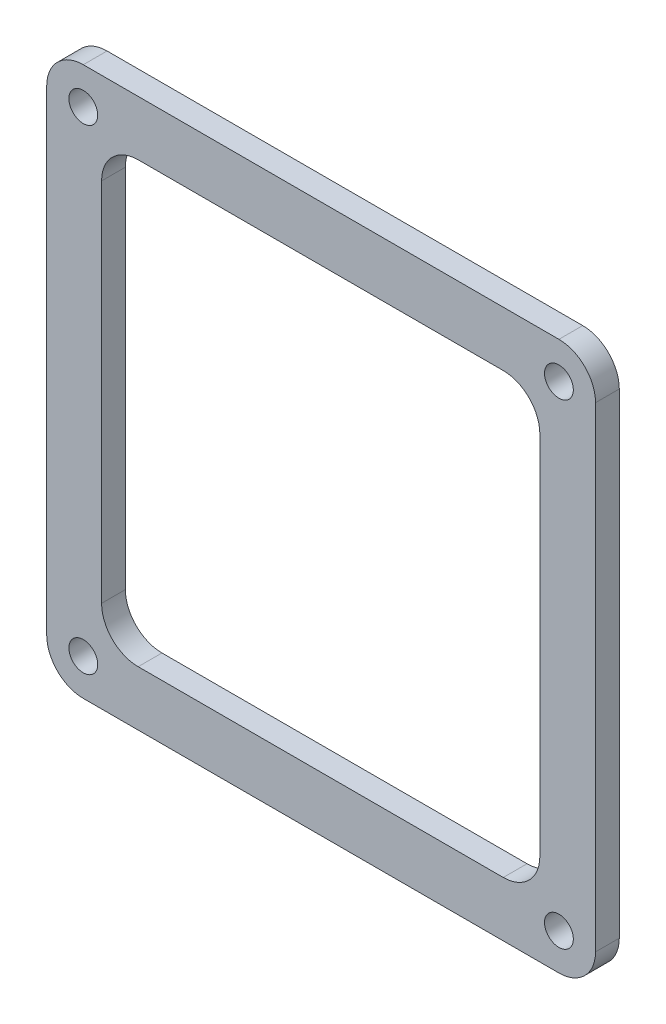
ISO-10303-21;
HEADER;
FILE_DESCRIPTION(('STEP AP214'),'2;1');
FILE_NAME('part.step','',(''),(''),'','','');
FILE_SCHEMA(('AUTOMOTIVE_DESIGN { 1 0 10303 214 1 1 1 1 }'));
ENDSEC;
DATA;
#1=APPLICATION_CONTEXT('core data for automotive mechanical design processes');
#2=APPLICATION_PROTOCOL_DEFINITION('international standard','automotive_design',2000,#1);
#3=PRODUCT_CONTEXT('',#1,'mechanical');
#4=PRODUCT('Part','Part','',(#3));
#5=PRODUCT_RELATED_PRODUCT_CATEGORY('part','',(#4));
#6=PRODUCT_DEFINITION_FORMATION('','',#4);
#7=PRODUCT_DEFINITION_CONTEXT('part definition',#1,'design');
#8=PRODUCT_DEFINITION('design','',#6,#7);
#9=PRODUCT_DEFINITION_SHAPE('','',#8);
#10=(LENGTH_UNIT() NAMED_UNIT(*) SI_UNIT(.MILLI.,.METRE.));
#11=(NAMED_UNIT(*) PLANE_ANGLE_UNIT() SI_UNIT($,.RADIAN.));
#12=(NAMED_UNIT(*) SI_UNIT($,.STERADIAN.) SOLID_ANGLE_UNIT());
#13=UNCERTAINTY_MEASURE_WITH_UNIT(LENGTH_MEASURE(1.E-05),#10,'distance_accuracy_value','');
#14=(GEOMETRIC_REPRESENTATION_CONTEXT(3) GLOBAL_UNCERTAINTY_ASSIGNED_CONTEXT((#13)) GLOBAL_UNIT_ASSIGNED_CONTEXT((#10,
#11,#12)) REPRESENTATION_CONTEXT('',''));
#15=CARTESIAN_POINT('',(0.,0.,0.));
#16=DIRECTION('',(0.,0.,1.));
#17=DIRECTION('',(1.,0.,0.));
#18=AXIS2_PLACEMENT_3D('',#15,#16,#17);
#19=CARTESIAN_POINT('',(2323.08711280439,1815.35890547452,2.6));
#20=DIRECTION('',(0.,0.,1.));
#21=DIRECTION('',(1.,0.,0.));
#22=AXIS2_PLACEMENT_3D('',#19,#20,#21);
#23=PLANE('',#22);
#24=CARTESIAN_POINT('',(2271.08711280439,1815.35890547452,2.6));
#25=DIRECTION('',(0.,0.,1.));
#26=DIRECTION('',(1.,0.,0.));
#27=AXIS2_PLACEMENT_3D('',#24,#25,#26);
#28=CIRCLE('',#27,1.57499999999988);
#29=CARTESIAN_POINT('',(2272.66211280439,1815.35890547452,2.6));
#30=VERTEX_POINT('',#29);
#31=EDGE_CURVE('E217',#30,#30,#28,.T.);
#32=ORIENTED_EDGE('',*,*,#31,.F.);
#33=EDGE_LOOP('',(#32));
#34=FACE_BOUND('',#33,.T.);
#35=CARTESIAN_POINT('',(2271.08711280439,1763.35890547452,2.6));
#36=DIRECTION('',(0.,0.,1.));
#37=DIRECTION('',(1.,0.,0.));
#38=AXIS2_PLACEMENT_3D('',#35,#36,#37);
#39=CIRCLE('',#38,1.57499999999988);
#40=CARTESIAN_POINT('',(2272.66211280439,1763.35890547452,2.6));
#41=VERTEX_POINT('',#40);
#42=EDGE_CURVE('E229',#41,#41,#39,.T.);
#43=ORIENTED_EDGE('',*,*,#42,.F.);
#44=EDGE_LOOP('',(#43));
#45=FACE_BOUND('',#44,.T.);
#46=CARTESIAN_POINT('',(2323.08711280439,1815.35890547452,2.6));
#47=DIRECTION('',(0.,0.,1.));
#48=DIRECTION('',(1.,0.,0.));
#49=AXIS2_PLACEMENT_3D('',#46,#47,#48);
#50=CIRCLE('',#49,4.);
#51=CARTESIAN_POINT('',(2327.08711280439,1815.35890547452,2.6));
#52=VERTEX_POINT('',#51);
#53=CARTESIAN_POINT('',(2323.08711280439,1819.35890547452,2.6));
#54=VERTEX_POINT('',#53);
#55=EDGE_CURVE('E235',#52,#54,#50,.T.);
#56=ORIENTED_EDGE('',*,*,#55,.T.);
#57=DIRECTION('',(-1.,0.,0.));
#58=VECTOR('',#57,1.);
#59=CARTESIAN_POINT('',(2271.08711280439,1819.35890547452,2.6));
#60=LINE('',#59,#58);
#61=CARTESIAN_POINT('',(2271.08711280439,1819.35890547452,2.6));
#62=VERTEX_POINT('',#61);
#63=EDGE_CURVE('E238',#54,#62,#60,.T.);
#64=ORIENTED_EDGE('',*,*,#63,.T.);
#65=CARTESIAN_POINT('',(2271.08711280439,1815.35890547452,2.6));
#66=DIRECTION('',(0.,0.,1.));
#67=DIRECTION('',(1.,0.,0.));
#68=AXIS2_PLACEMENT_3D('',#65,#66,#67);
#69=CIRCLE('',#68,4.);
#70=CARTESIAN_POINT('',(2267.08711280439,1815.35890547452,2.6));
#71=VERTEX_POINT('',#70);
#72=EDGE_CURVE('E241',#62,#71,#69,.T.);
#73=ORIENTED_EDGE('',*,*,#72,.T.);
#74=DIRECTION('',(0.,-1.,0.));
#75=VECTOR('',#74,1.);
#76=CARTESIAN_POINT('',(2267.08711280439,1815.35890547452,2.6));
#77=LINE('',#76,#75);
#78=CARTESIAN_POINT('',(2267.08711280439,1763.35890547452,2.6));
#79=VERTEX_POINT('',#78);
#80=EDGE_CURVE('E243',#71,#79,#77,.T.);
#81=ORIENTED_EDGE('',*,*,#80,.T.);
#82=CARTESIAN_POINT('',(2271.08711280439,1763.35890547452,2.6));
#83=DIRECTION('',(0.,0.,1.));
#84=DIRECTION('',(1.,0.,0.));
#85=AXIS2_PLACEMENT_3D('',#82,#83,#84);
#86=CIRCLE('',#85,4.);
#87=CARTESIAN_POINT('',(2271.08711280439,1759.35890547452,2.6));
#88=VERTEX_POINT('',#87);
#89=EDGE_CURVE('E245',#79,#88,#86,.T.);
#90=ORIENTED_EDGE('',*,*,#89,.T.);
#91=DIRECTION('',(1.,0.,0.));
#92=VECTOR('',#91,1.);
#93=CARTESIAN_POINT('',(2271.08711280439,1759.35890547452,2.6));
#94=LINE('',#93,#92);
#95=CARTESIAN_POINT('',(2323.08711280439,1759.35890547452,2.6));
#96=VERTEX_POINT('',#95);
#97=EDGE_CURVE('E247',#88,#96,#94,.T.);
#98=ORIENTED_EDGE('',*,*,#97,.T.);
#99=CARTESIAN_POINT('',(2323.08711280439,1763.35890547452,2.6));
#100=DIRECTION('',(0.,0.,1.));
#101=DIRECTION('',(1.,0.,0.));
#102=AXIS2_PLACEMENT_3D('',#99,#100,#101);
#103=CIRCLE('',#102,4.);
#104=CARTESIAN_POINT('',(2327.08711280439,1763.35890547452,2.6));
#105=VERTEX_POINT('',#104);
#106=EDGE_CURVE('E249',#96,#105,#103,.T.);
#107=ORIENTED_EDGE('',*,*,#106,.T.);
#108=DIRECTION('',(0.,1.,0.));
#109=VECTOR('',#108,1.);
#110=CARTESIAN_POINT('',(2327.08711280439,1763.35890547452,2.6));
#111=LINE('',#110,#109);
#112=EDGE_CURVE('E251',#105,#52,#111,.T.);
#113=ORIENTED_EDGE('',*,*,#112,.T.);
#114=EDGE_LOOP('',(#56,#64,#73,#81,#90,#98,#107,#113));
#115=FACE_BOUND('',#114,.T.);
#116=CARTESIAN_POINT('',(2323.08711280439,1763.35890547452,2.6));
#117=DIRECTION('',(0.,0.,1.));
#118=DIRECTION('',(1.,0.,0.));
#119=AXIS2_PLACEMENT_3D('',#116,#117,#118);
#120=CIRCLE('',#119,1.57499999999988);
#121=CARTESIAN_POINT('',(2324.66211280439,1763.35890547452,2.6));
#122=VERTEX_POINT('',#121);
#123=EDGE_CURVE('E223',#122,#122,#120,.T.);
#124=ORIENTED_EDGE('',*,*,#123,.F.);
#125=EDGE_LOOP('',(#124));
#126=FACE_BOUND('',#125,.T.);
#127=CARTESIAN_POINT('',(2323.08711280439,1815.35890547452,2.6));
#128=DIRECTION('',(0.,0.,1.));
#129=DIRECTION('',(1.,0.,0.));
#130=AXIS2_PLACEMENT_3D('',#127,#128,#129);
#131=CIRCLE('',#130,1.57499999999988);
#132=CARTESIAN_POINT('',(2324.66211280439,1815.35890547452,2.6));
#133=VERTEX_POINT('',#132);
#134=EDGE_CURVE('E211',#133,#133,#131,.T.);
#135=ORIENTED_EDGE('',*,*,#134,.F.);
#136=EDGE_LOOP('',(#135));
#137=FACE_BOUND('',#136,.T.);
#138=DIRECTION('',(-1.,0.,0.));
#139=VECTOR('',#138,1.);
#140=CARTESIAN_POINT('',(2295.48348301945,1813.35761142783,2.6));
#141=LINE('',#140,#139);
#142=CARTESIAN_POINT('',(2317.00050245466,1813.35761142783,2.6));
#143=VERTEX_POINT('',#142);
#144=CARTESIAN_POINT('',(2277.08711280439,1813.35761142783,2.6));
#145=VERTEX_POINT('',#144);
#146=EDGE_CURVE('E154',#143,#145,#141,.T.);
#147=ORIENTED_EDGE('',*,*,#146,.F.);
#148=CARTESIAN_POINT('',(2317.00050245466,1809.35761142783,2.6));
#149=DIRECTION('',(0.,0.,1.));
#150=DIRECTION('',(1.,0.,0.));
#151=AXIS2_PLACEMENT_3D('',#148,#149,#150);
#152=CIRCLE('',#151,4.00000000000023);
#153=CARTESIAN_POINT('',(2321.00050245466,1809.35761142783,2.6));
#154=VERTEX_POINT('',#153);
#155=EDGE_CURVE('E146',#154,#143,#152,.T.);
#156=ORIENTED_EDGE('',*,*,#155,.F.);
#157=DIRECTION('',(0.,1.,0.));
#158=VECTOR('',#157,1.);
#159=CARTESIAN_POINT('',(2321.00050245466,1809.35761142783,2.6));
#160=LINE('',#159,#158);
#161=CARTESIAN_POINT('',(2321.00050245466,1769.36244502732,2.6));
#162=VERTEX_POINT('',#161);
#163=EDGE_CURVE('E179',#162,#154,#160,.T.);
#164=ORIENTED_EDGE('',*,*,#163,.F.);
#165=CARTESIAN_POINT('',(2317.00050245466,1769.36244502732,2.6));
#166=DIRECTION('',(0.,0.,1.));
#167=DIRECTION('',(1.,0.,0.));
#168=AXIS2_PLACEMENT_3D('',#165,#166,#167);
#169=CIRCLE('',#168,4.00000000000023);
#170=CARTESIAN_POINT('',(2317.00050245466,1765.36244502732,2.6));
#171=VERTEX_POINT('',#170);
#172=EDGE_CURVE('E177',#171,#162,#169,.T.);
#173=ORIENTED_EDGE('',*,*,#172,.F.);
#174=DIRECTION('',(1.,0.,0.));
#175=VECTOR('',#174,1.);
#176=CARTESIAN_POINT('',(2317.00050245466,1765.36244502732,2.6));
#177=LINE('',#176,#175);
#178=CARTESIAN_POINT('',(2277.08711280439,1765.36244502732,2.6));
#179=VERTEX_POINT('',#178);
#180=EDGE_CURVE('E175',#179,#171,#177,.T.);
#181=ORIENTED_EDGE('',*,*,#180,.F.);
#182=CARTESIAN_POINT('',(2277.08711280439,1769.36244502732,2.6));
#183=DIRECTION('',(0.,0.,1.));
#184=DIRECTION('',(1.,0.,0.));
#185=AXIS2_PLACEMENT_3D('',#182,#183,#184);
#186=CIRCLE('',#185,4.);
#187=CARTESIAN_POINT('',(2273.08711280439,1769.36244502732,2.6));
#188=VERTEX_POINT('',#187);
#189=EDGE_CURVE('E173',#188,#179,#186,.T.);
#190=ORIENTED_EDGE('',*,*,#189,.F.);
#191=DIRECTION('',(0.,-1.,0.));
#192=VECTOR('',#191,1.);
#193=CARTESIAN_POINT('',(2273.08711280439,1769.36244502732,2.6));
#194=LINE('',#193,#192);
#195=CARTESIAN_POINT('',(2273.08711280439,1809.35761142783,2.6));
#196=VERTEX_POINT('',#195);
#197=EDGE_CURVE('E169',#196,#188,#194,.T.);
#198=ORIENTED_EDGE('',*,*,#197,.F.);
#199=CARTESIAN_POINT('',(2277.08711280439,1809.35761142783,2.6));
#200=DIRECTION('',(0.,0.,1.));
#201=DIRECTION('',(1.,0.,0.));
#202=AXIS2_PLACEMENT_3D('',#199,#200,#201);
#203=CIRCLE('',#202,4.);
#204=EDGE_CURVE('E167',#145,#196,#203,.T.);
#205=ORIENTED_EDGE('',*,*,#204,.F.);
#206=EDGE_LOOP('',(#147,#156,#164,#173,#181,#190,#198,#205));
#207=FACE_BOUND('',#206,.T.);
#208=ADVANCED_FACE('F33',(#34,#45,#115,#126,#137,#207),#23,.T.);
#209=CARTESIAN_POINT('',(2323.08711280439,1815.35890547452,0.));
#210=DIRECTION('',(0.,0.,1.));
#211=DIRECTION('',(1.,0.,0.));
#212=AXIS2_PLACEMENT_3D('',#209,#210,#211);
#213=PLANE('',#212);
#214=CARTESIAN_POINT('',(2323.08711280439,1815.35890547452,0.));
#215=DIRECTION('',(0.,0.,1.));
#216=DIRECTION('',(1.,0.,0.));
#217=AXIS2_PLACEMENT_3D('',#214,#215,#216);
#218=CIRCLE('',#217,1.57499999999988);
#219=CARTESIAN_POINT('',(2324.66211280439,1815.35890547452,0.));
#220=VERTEX_POINT('',#219);
#221=EDGE_CURVE('E162',#220,#220,#218,.T.);
#222=ORIENTED_EDGE('',*,*,#221,.T.);
#223=EDGE_LOOP('',(#222));
#224=FACE_BOUND('',#223,.T.);
#225=CARTESIAN_POINT('',(2271.08711280439,1815.35890547452,0.));
#226=DIRECTION('',(0.,0.,1.));
#227=DIRECTION('',(1.,0.,0.));
#228=AXIS2_PLACEMENT_3D('',#225,#226,#227);
#229=CIRCLE('',#228,1.57499999999988);
#230=CARTESIAN_POINT('',(2272.66211280439,1815.35890547452,0.));
#231=VERTEX_POINT('',#230);
#232=EDGE_CURVE('E214',#231,#231,#229,.T.);
#233=ORIENTED_EDGE('',*,*,#232,.T.);
#234=EDGE_LOOP('',(#233));
#235=FACE_BOUND('',#234,.T.);
#236=CARTESIAN_POINT('',(2323.08711280439,1763.35890547452,0.));
#237=DIRECTION('',(0.,0.,1.));
#238=DIRECTION('',(1.,0.,0.));
#239=AXIS2_PLACEMENT_3D('',#236,#237,#238);
#240=CIRCLE('',#239,1.57499999999988);
#241=CARTESIAN_POINT('',(2324.66211280439,1763.35890547452,0.));
#242=VERTEX_POINT('',#241);
#243=EDGE_CURVE('E220',#242,#242,#240,.T.);
#244=ORIENTED_EDGE('',*,*,#243,.T.);
#245=EDGE_LOOP('',(#244));
#246=FACE_BOUND('',#245,.T.);
#247=CARTESIAN_POINT('',(2271.08711280439,1763.35890547452,0.));
#248=DIRECTION('',(0.,0.,1.));
#249=DIRECTION('',(1.,0.,0.));
#250=AXIS2_PLACEMENT_3D('',#247,#248,#249);
#251=CIRCLE('',#250,1.57499999999988);
#252=CARTESIAN_POINT('',(2272.66211280439,1763.35890547452,0.));
#253=VERTEX_POINT('',#252);
#254=EDGE_CURVE('E226',#253,#253,#251,.T.);
#255=ORIENTED_EDGE('',*,*,#254,.T.);
#256=EDGE_LOOP('',(#255));
#257=FACE_BOUND('',#256,.T.);
#258=CARTESIAN_POINT('',(2323.08711280439,1815.35890547452,0.));
#259=DIRECTION('',(0.,0.,1.));
#260=DIRECTION('',(1.,0.,0.));
#261=AXIS2_PLACEMENT_3D('',#258,#259,#260);
#262=CIRCLE('',#261,4.);
#263=CARTESIAN_POINT('',(2327.08711280439,1815.35890547452,0.));
#264=VERTEX_POINT('',#263);
#265=CARTESIAN_POINT('',(2323.08711280439,1819.35890547452,0.));
#266=VERTEX_POINT('',#265);
#267=EDGE_CURVE('E232',#264,#266,#262,.T.);
#268=ORIENTED_EDGE('',*,*,#267,.F.);
#269=DIRECTION('',(0.,1.,0.));
#270=VECTOR('',#269,1.);
#271=CARTESIAN_POINT('',(2327.08711280439,1763.35890547452,0.));
#272=LINE('',#271,#270);
#273=CARTESIAN_POINT('',(2327.08711280439,1763.35890547452,0.));
#274=VERTEX_POINT('',#273);
#275=EDGE_CURVE('E239',#274,#264,#272,.T.);
#276=ORIENTED_EDGE('',*,*,#275,.F.);
#277=CARTESIAN_POINT('',(2323.08711280439,1763.35890547452,0.));
#278=DIRECTION('',(0.,0.,1.));
#279=DIRECTION('',(1.,0.,0.));
#280=AXIS2_PLACEMENT_3D('',#277,#278,#279);
#281=CIRCLE('',#280,4.);
#282=CARTESIAN_POINT('',(2323.08711280439,1759.35890547452,0.));
#283=VERTEX_POINT('',#282);
#284=EDGE_CURVE('E266',#283,#274,#281,.T.);
#285=ORIENTED_EDGE('',*,*,#284,.F.);
#286=DIRECTION('',(1.,0.,0.));
#287=VECTOR('',#286,1.);
#288=CARTESIAN_POINT('',(2271.08711280439,1759.35890547452,0.));
#289=LINE('',#288,#287);
#290=CARTESIAN_POINT('',(2271.08711280439,1759.35890547452,0.));
#291=VERTEX_POINT('',#290);
#292=EDGE_CURVE('E264',#291,#283,#289,.T.);
#293=ORIENTED_EDGE('',*,*,#292,.F.);
#294=CARTESIAN_POINT('',(2271.08711280439,1763.35890547452,0.));
#295=DIRECTION('',(0.,0.,1.));
#296=DIRECTION('',(1.,0.,0.));
#297=AXIS2_PLACEMENT_3D('',#294,#295,#296);
#298=CIRCLE('',#297,4.);
#299=CARTESIAN_POINT('',(2267.08711280439,1763.35890547452,0.));
#300=VERTEX_POINT('',#299);
#301=EDGE_CURVE('E262',#300,#291,#298,.T.);
#302=ORIENTED_EDGE('',*,*,#301,.F.);
#303=DIRECTION('',(0.,-1.,0.));
#304=VECTOR('',#303,1.);
#305=CARTESIAN_POINT('',(2267.08711280439,1815.35890547452,0.));
#306=LINE('',#305,#304);
#307=CARTESIAN_POINT('',(2267.08711280439,1815.35890547452,0.));
#308=VERTEX_POINT('',#307);
#309=EDGE_CURVE('E260',#308,#300,#306,.T.);
#310=ORIENTED_EDGE('',*,*,#309,.F.);
#311=CARTESIAN_POINT('',(2271.08711280439,1815.35890547452,0.));
#312=DIRECTION('',(0.,0.,1.));
#313=DIRECTION('',(1.,0.,0.));
#314=AXIS2_PLACEMENT_3D('',#311,#312,#313);
#315=CIRCLE('',#314,4.);
#316=CARTESIAN_POINT('',(2271.08711280439,1819.35890547452,0.));
#317=VERTEX_POINT('',#316);
#318=EDGE_CURVE('E258',#317,#308,#315,.T.);
#319=ORIENTED_EDGE('',*,*,#318,.F.);
#320=DIRECTION('',(-1.,0.,0.));
#321=VECTOR('',#320,1.);
#322=CARTESIAN_POINT('',(2271.08711280439,1819.35890547452,0.));
#323=LINE('',#322,#321);
#324=EDGE_CURVE('E256',#266,#317,#323,.T.);
#325=ORIENTED_EDGE('',*,*,#324,.F.);
#326=EDGE_LOOP('',(#268,#276,#285,#293,#302,#310,#319,#325));
#327=FACE_BOUND('',#326,.T.);
#328=CARTESIAN_POINT('',(2317.00050245466,1809.35761142783,0.));
#329=DIRECTION('',(0.,0.,1.));
#330=DIRECTION('',(1.,0.,0.));
#331=AXIS2_PLACEMENT_3D('',#328,#329,#330);
#332=CIRCLE('',#331,4.00000000000023);
#333=CARTESIAN_POINT('',(2321.00050245466,1809.35761142783,0.));
#334=VERTEX_POINT('',#333);
#335=CARTESIAN_POINT('',(2317.00050245466,1813.35761142783,0.));
#336=VERTEX_POINT('',#335);
#337=EDGE_CURVE('E56',#334,#336,#332,.T.);
#338=ORIENTED_EDGE('',*,*,#337,.T.);
#339=DIRECTION('',(-1.,0.,0.));
#340=VECTOR('',#339,1.);
#341=CARTESIAN_POINT('',(2277.08711280439,1813.35761142783,0.));
#342=LINE('',#341,#340);
#343=CARTESIAN_POINT('',(2277.08711280439,1813.35761142783,0.));
#344=VERTEX_POINT('',#343);
#345=EDGE_CURVE('E161',#336,#344,#342,.T.);
#346=ORIENTED_EDGE('',*,*,#345,.T.);
#347=CARTESIAN_POINT('',(2277.08711280439,1809.35761142783,0.));
#348=DIRECTION('',(0.,0.,1.));
#349=DIRECTION('',(1.,0.,0.));
#350=AXIS2_PLACEMENT_3D('',#347,#348,#349);
#351=CIRCLE('',#350,4.);
#352=CARTESIAN_POINT('',(2273.08711280439,1809.35761142783,0.));
#353=VERTEX_POINT('',#352);
#354=EDGE_CURVE('E183',#344,#353,#351,.T.);
#355=ORIENTED_EDGE('',*,*,#354,.T.);
#356=DIRECTION('',(0.,-1.,0.));
#357=VECTOR('',#356,1.);
#358=CARTESIAN_POINT('',(2273.08711280439,1769.36244502732,0.));
#359=LINE('',#358,#357);
#360=CARTESIAN_POINT('',(2273.08711280439,1769.36244502732,0.));
#361=VERTEX_POINT('',#360);
#362=EDGE_CURVE('E186',#353,#361,#359,.T.);
#363=ORIENTED_EDGE('',*,*,#362,.T.);
#364=CARTESIAN_POINT('',(2277.08711280439,1769.36244502732,0.));
#365=DIRECTION('',(0.,0.,1.));
#366=DIRECTION('',(1.,0.,0.));
#367=AXIS2_PLACEMENT_3D('',#364,#365,#366);
#368=CIRCLE('',#367,4.);
#369=CARTESIAN_POINT('',(2277.08711280439,1765.36244502732,0.));
#370=VERTEX_POINT('',#369);
#371=EDGE_CURVE('E189',#361,#370,#368,.T.);
#372=ORIENTED_EDGE('',*,*,#371,.T.);
#373=DIRECTION('',(1.,0.,0.));
#374=VECTOR('',#373,1.);
#375=CARTESIAN_POINT('',(2317.00050245466,1765.36244502732,0.));
#376=LINE('',#375,#374);
#377=CARTESIAN_POINT('',(2317.00050245466,1765.36244502732,0.));
#378=VERTEX_POINT('',#377);
#379=EDGE_CURVE('E192',#370,#378,#376,.T.);
#380=ORIENTED_EDGE('',*,*,#379,.T.);
#381=CARTESIAN_POINT('',(2317.00050245466,1769.36244502732,0.));
#382=DIRECTION('',(0.,0.,1.));
#383=DIRECTION('',(1.,0.,0.));
#384=AXIS2_PLACEMENT_3D('',#381,#382,#383);
#385=CIRCLE('',#384,4.00000000000023);
#386=CARTESIAN_POINT('',(2321.00050245466,1769.36244502732,0.));
#387=VERTEX_POINT('',#386);
#388=EDGE_CURVE('E195',#378,#387,#385,.T.);
#389=ORIENTED_EDGE('',*,*,#388,.T.);
#390=DIRECTION('',(0.,1.,0.));
#391=VECTOR('',#390,1.);
#392=CARTESIAN_POINT('',(2321.00050245466,1809.35761142783,0.));
#393=LINE('',#392,#391);
#394=EDGE_CURVE('E155',#387,#334,#393,.T.);
#395=ORIENTED_EDGE('',*,*,#394,.T.);
#396=EDGE_LOOP('',(#338,#346,#355,#363,#372,#380,#389,#395));
#397=FACE_BOUND('',#396,.T.);
#398=ADVANCED_FACE('F296',(#224,#235,#246,#257,#327,#397),#213,.F.);
#399=CARTESIAN_POINT('',(2323.08711280439,1815.35890547452,2.6));
#400=DIRECTION('',(0.,0.,-1.));
#401=DIRECTION('',(-1.,0.,0.));
#402=AXIS2_PLACEMENT_3D('',#399,#400,#401);
#403=CYLINDRICAL_SURFACE('',#402,4.);
#404=ORIENTED_EDGE('',*,*,#267,.T.);
#405=DIRECTION('',(0.,0.,-1.));
#406=VECTOR('',#405,1.);
#407=CARTESIAN_POINT('',(2323.08711280439,1819.35890547452,2.6));
#408=LINE('',#407,#406);
#409=EDGE_CURVE('E11',#54,#266,#408,.T.);
#410=ORIENTED_EDGE('',*,*,#409,.F.);
#411=ORIENTED_EDGE('',*,*,#55,.F.);
#412=DIRECTION('',(0.,0.,-1.));
#413=VECTOR('',#412,1.);
#414=CARTESIAN_POINT('',(2327.08711280439,1815.35890547452,2.6));
#415=LINE('',#414,#413);
#416=EDGE_CURVE('E253',#52,#264,#415,.T.);
#417=ORIENTED_EDGE('',*,*,#416,.T.);
#418=EDGE_LOOP('',(#404,#410,#411,#417));
#419=FACE_BOUND('',#418,.T.);
#420=ADVANCED_FACE('F35',(#419),#403,.T.);
#421=CARTESIAN_POINT('',(2271.08711280439,1819.35890547452,2.6));
#422=DIRECTION('',(0.,-1.,0.));
#423=DIRECTION('',(0.,0.,-1.));
#424=AXIS2_PLACEMENT_3D('',#421,#422,#423);
#425=PLANE('',#424);
#426=ORIENTED_EDGE('',*,*,#324,.T.);
#427=DIRECTION('',(0.,0.,-1.));
#428=VECTOR('',#427,1.);
#429=CARTESIAN_POINT('',(2271.08711280439,1819.35890547452,2.6));
#430=LINE('',#429,#428);
#431=EDGE_CURVE('E41',#62,#317,#430,.T.);
#432=ORIENTED_EDGE('',*,*,#431,.F.);
#433=ORIENTED_EDGE('',*,*,#63,.F.);
#434=ORIENTED_EDGE('',*,*,#409,.T.);
#435=EDGE_LOOP('',(#426,#432,#433,#434));
#436=FACE_BOUND('',#435,.T.);
#437=ADVANCED_FACE('F314',(#436),#425,.F.);
#438=CARTESIAN_POINT('',(2271.08711280439,1815.35890547452,2.6));
#439=DIRECTION('',(0.,0.,-1.));
#440=DIRECTION('',(-1.,0.,0.));
#441=AXIS2_PLACEMENT_3D('',#438,#439,#440);
#442=CYLINDRICAL_SURFACE('',#441,4.);
#443=ORIENTED_EDGE('',*,*,#318,.T.);
#444=DIRECTION('',(0.,0.,-1.));
#445=VECTOR('',#444,1.);
#446=CARTESIAN_POINT('',(2267.08711280439,1815.35890547452,2.6));
#447=LINE('',#446,#445);
#448=EDGE_CURVE('E283',#71,#308,#447,.T.);
#449=ORIENTED_EDGE('',*,*,#448,.F.);
#450=ORIENTED_EDGE('',*,*,#72,.F.);
#451=ORIENTED_EDGE('',*,*,#431,.T.);
#452=EDGE_LOOP('',(#443,#449,#450,#451));
#453=FACE_BOUND('',#452,.T.);
#454=ADVANCED_FACE('F290',(#453),#442,.T.);
#455=CARTESIAN_POINT('',(2267.08711280439,1815.35890547452,2.6));
#456=DIRECTION('',(1.,0.,0.));
#457=DIRECTION('',(0.,0.,-1.));
#458=AXIS2_PLACEMENT_3D('',#455,#456,#457);
#459=PLANE('',#458);
#460=ORIENTED_EDGE('',*,*,#309,.T.);
#461=DIRECTION('',(0.,0.,-1.));
#462=VECTOR('',#461,1.);
#463=CARTESIAN_POINT('',(2267.08711280439,1763.35890547452,2.6));
#464=LINE('',#463,#462);
#465=EDGE_CURVE('E280',#79,#300,#464,.T.);
#466=ORIENTED_EDGE('',*,*,#465,.F.);
#467=ORIENTED_EDGE('',*,*,#80,.F.);
#468=ORIENTED_EDGE('',*,*,#448,.T.);
#469=EDGE_LOOP('',(#460,#466,#467,#468));
#470=FACE_BOUND('',#469,.T.);
#471=ADVANCED_FACE('F302',(#470),#459,.F.);
#472=CARTESIAN_POINT('',(2271.08711280439,1763.35890547452,2.6));
#473=DIRECTION('',(0.,0.,-1.));
#474=DIRECTION('',(-1.,0.,0.));
#475=AXIS2_PLACEMENT_3D('',#472,#473,#474);
#476=CYLINDRICAL_SURFACE('',#475,4.);
#477=ORIENTED_EDGE('',*,*,#301,.T.);
#478=DIRECTION('',(0.,0.,-1.));
#479=VECTOR('',#478,1.);
#480=CARTESIAN_POINT('',(2271.08711280439,1759.35890547452,2.6));
#481=LINE('',#480,#479);
#482=EDGE_CURVE('E277',#88,#291,#481,.T.);
#483=ORIENTED_EDGE('',*,*,#482,.F.);
#484=ORIENTED_EDGE('',*,*,#89,.F.);
#485=ORIENTED_EDGE('',*,*,#465,.T.);
#486=EDGE_LOOP('',(#477,#483,#484,#485));
#487=FACE_BOUND('',#486,.T.);
#488=ADVANCED_FACE('F306',(#487),#476,.T.);
#489=CARTESIAN_POINT('',(2271.08711280439,1759.35890547452,2.6));
#490=DIRECTION('',(0.,1.,0.));
#491=DIRECTION('',(0.,0.,1.));
#492=AXIS2_PLACEMENT_3D('',#489,#490,#491);
#493=PLANE('',#492);
#494=ORIENTED_EDGE('',*,*,#292,.T.);
#495=DIRECTION('',(0.,0.,-1.));
#496=VECTOR('',#495,1.);
#497=CARTESIAN_POINT('',(2323.08711280439,1759.35890547452,2.6));
#498=LINE('',#497,#496);
#499=EDGE_CURVE('E274',#96,#283,#498,.T.);
#500=ORIENTED_EDGE('',*,*,#499,.F.);
#501=ORIENTED_EDGE('',*,*,#97,.F.);
#502=ORIENTED_EDGE('',*,*,#482,.T.);
#503=EDGE_LOOP('',(#494,#500,#501,#502));
#504=FACE_BOUND('',#503,.T.);
#505=ADVANCED_FACE('F327',(#504),#493,.F.);
#506=CARTESIAN_POINT('',(2323.08711280439,1763.35890547452,2.6));
#507=DIRECTION('',(0.,0.,-1.));
#508=DIRECTION('',(-1.,0.,0.));
#509=AXIS2_PLACEMENT_3D('',#506,#507,#508);
#510=CYLINDRICAL_SURFACE('',#509,4.);
#511=ORIENTED_EDGE('',*,*,#284,.T.);
#512=DIRECTION('',(0.,0.,-1.));
#513=VECTOR('',#512,1.);
#514=CARTESIAN_POINT('',(2327.08711280439,1763.35890547452,2.6));
#515=LINE('',#514,#513);
#516=EDGE_CURVE('E271',#105,#274,#515,.T.);
#517=ORIENTED_EDGE('',*,*,#516,.F.);
#518=ORIENTED_EDGE('',*,*,#106,.F.);
#519=ORIENTED_EDGE('',*,*,#499,.T.);
#520=EDGE_LOOP('',(#511,#517,#518,#519));
#521=FACE_BOUND('',#520,.T.);
#522=ADVANCED_FACE('F325',(#521),#510,.T.);
#523=CARTESIAN_POINT('',(2327.08711280439,1763.35890547452,2.6));
#524=DIRECTION('',(-1.,0.,0.));
#525=DIRECTION('',(0.,0.,1.));
#526=AXIS2_PLACEMENT_3D('',#523,#524,#525);
#527=PLANE('',#526);
#528=ORIENTED_EDGE('',*,*,#275,.T.);
#529=ORIENTED_EDGE('',*,*,#416,.F.);
#530=ORIENTED_EDGE('',*,*,#112,.F.);
#531=ORIENTED_EDGE('',*,*,#516,.T.);
#532=EDGE_LOOP('',(#528,#529,#530,#531));
#533=FACE_BOUND('',#532,.T.);
#534=ADVANCED_FACE('F320',(#533),#527,.F.);
#535=CARTESIAN_POINT('',(2271.08711280439,1763.35890547452,2.6));
#536=DIRECTION('',(0.,0.,-1.));
#537=DIRECTION('',(-1.,0.,0.));
#538=AXIS2_PLACEMENT_3D('',#535,#536,#537);
#539=CYLINDRICAL_SURFACE('',#538,1.57499999999988);
#540=ORIENTED_EDGE('',*,*,#42,.T.);
#541=EDGE_LOOP('',(#540));
#542=FACE_BOUND('',#541,.T.);
#543=ORIENTED_EDGE('',*,*,#254,.F.);
#544=EDGE_LOOP('',(#543));
#545=FACE_BOUND('',#544,.T.);
#546=ADVANCED_FACE('F347',(#542,#545),#539,.F.);
#547=CARTESIAN_POINT('',(2323.08711280439,1763.35890547452,2.6));
#548=DIRECTION('',(0.,0.,-1.));
#549=DIRECTION('',(-1.,0.,0.));
#550=AXIS2_PLACEMENT_3D('',#547,#548,#549);
#551=CYLINDRICAL_SURFACE('',#550,1.57499999999988);
#552=ORIENTED_EDGE('',*,*,#123,.T.);
#553=EDGE_LOOP('',(#552));
#554=FACE_BOUND('',#553,.T.);
#555=ORIENTED_EDGE('',*,*,#243,.F.);
#556=EDGE_LOOP('',(#555));
#557=FACE_BOUND('',#556,.T.);
#558=ADVANCED_FACE('F354',(#554,#557),#551,.F.);
#559=CARTESIAN_POINT('',(2271.08711280439,1815.35890547452,2.6));
#560=DIRECTION('',(0.,0.,-1.));
#561=DIRECTION('',(-1.,0.,0.));
#562=AXIS2_PLACEMENT_3D('',#559,#560,#561);
#563=CYLINDRICAL_SURFACE('',#562,1.57499999999988);
#564=ORIENTED_EDGE('',*,*,#31,.T.);
#565=EDGE_LOOP('',(#564));
#566=FACE_BOUND('',#565,.T.);
#567=ORIENTED_EDGE('',*,*,#232,.F.);
#568=EDGE_LOOP('',(#567));
#569=FACE_BOUND('',#568,.T.);
#570=ADVANCED_FACE('F359',(#566,#569),#563,.F.);
#571=CARTESIAN_POINT('',(2323.08711280439,1815.35890547452,2.6));
#572=DIRECTION('',(0.,0.,-1.));
#573=DIRECTION('',(-1.,0.,0.));
#574=AXIS2_PLACEMENT_3D('',#571,#572,#573);
#575=CYLINDRICAL_SURFACE('',#574,1.57499999999988);
#576=ORIENTED_EDGE('',*,*,#134,.T.);
#577=EDGE_LOOP('',(#576));
#578=FACE_BOUND('',#577,.T.);
#579=ORIENTED_EDGE('',*,*,#221,.F.);
#580=EDGE_LOOP('',(#579));
#581=FACE_BOUND('',#580,.T.);
#582=ADVANCED_FACE('F368',(#578,#581),#575,.F.);
#583=CARTESIAN_POINT('',(2317.00050245466,1809.35761142783,2.6));
#584=DIRECTION('',(0.,0.,-1.));
#585=DIRECTION('',(-1.,0.,0.));
#586=AXIS2_PLACEMENT_3D('',#583,#584,#585);
#587=CYLINDRICAL_SURFACE('',#586,4.00000000000023);
#588=ORIENTED_EDGE('',*,*,#337,.F.);
#589=DIRECTION('',(0.,0.,-1.));
#590=VECTOR('',#589,1.);
#591=CARTESIAN_POINT('',(2321.00050245466,1809.35761142783,2.6));
#592=LINE('',#591,#590);
#593=EDGE_CURVE('E150',#154,#334,#592,.T.);
#594=ORIENTED_EDGE('',*,*,#593,.F.);
#595=ORIENTED_EDGE('',*,*,#155,.T.);
#596=DIRECTION('',(0.,0.,-1.));
#597=VECTOR('',#596,1.);
#598=CARTESIAN_POINT('',(2317.00050245466,1813.35761142783,2.6));
#599=LINE('',#598,#597);
#600=EDGE_CURVE('E149',#143,#336,#599,.T.);
#601=ORIENTED_EDGE('',*,*,#600,.T.);
#602=EDGE_LOOP('',(#588,#594,#595,#601));
#603=FACE_BOUND('',#602,.T.);
#604=ADVANCED_FACE('F148',(#603),#587,.F.);
#605=CARTESIAN_POINT('',(2277.08711280439,1813.35761142783,2.6));
#606=DIRECTION('',(0.,-1.,0.));
#607=DIRECTION('',(0.,0.,-1.));
#608=AXIS2_PLACEMENT_3D('',#605,#606,#607);
#609=PLANE('',#608);
#610=ORIENTED_EDGE('',*,*,#345,.F.);
#611=ORIENTED_EDGE('',*,*,#600,.F.);
#612=ORIENTED_EDGE('',*,*,#146,.T.);
#613=DIRECTION('',(0.,0.,-1.));
#614=VECTOR('',#613,1.);
#615=CARTESIAN_POINT('',(2277.08711280439,1813.35761142783,2.6));
#616=LINE('',#615,#614);
#617=EDGE_CURVE('E163',#145,#344,#616,.T.);
#618=ORIENTED_EDGE('',*,*,#617,.T.);
#619=EDGE_LOOP('',(#610,#611,#612,#618));
#620=FACE_BOUND('',#619,.T.);
#621=ADVANCED_FACE('F158',(#620),#609,.T.);
#622=CARTESIAN_POINT('',(2277.08711280439,1809.35761142783,2.6));
#623=DIRECTION('',(0.,0.,-1.));
#624=DIRECTION('',(-1.,0.,0.));
#625=AXIS2_PLACEMENT_3D('',#622,#623,#624);
#626=CYLINDRICAL_SURFACE('',#625,4.);
#627=ORIENTED_EDGE('',*,*,#354,.F.);
#628=ORIENTED_EDGE('',*,*,#617,.F.);
#629=ORIENTED_EDGE('',*,*,#204,.T.);
#630=DIRECTION('',(0.,0.,-1.));
#631=VECTOR('',#630,1.);
#632=CARTESIAN_POINT('',(2273.08711280439,1809.35761142783,2.6));
#633=LINE('',#632,#631);
#634=EDGE_CURVE('E208',#196,#353,#633,.T.);
#635=ORIENTED_EDGE('',*,*,#634,.T.);
#636=EDGE_LOOP('',(#627,#628,#629,#635));
#637=FACE_BOUND('',#636,.T.);
#638=ADVANCED_FACE('F380',(#637),#626,.F.);
#639=CARTESIAN_POINT('',(2273.08711280439,1769.36244502732,2.6));
#640=DIRECTION('',(1.,0.,0.));
#641=DIRECTION('',(0.,0.,-1.));
#642=AXIS2_PLACEMENT_3D('',#639,#640,#641);
#643=PLANE('',#642);
#644=ORIENTED_EDGE('',*,*,#362,.F.);
#645=ORIENTED_EDGE('',*,*,#634,.F.);
#646=ORIENTED_EDGE('',*,*,#197,.T.);
#647=DIRECTION('',(0.,0.,-1.));
#648=VECTOR('',#647,1.);
#649=CARTESIAN_POINT('',(2273.08711280439,1769.36244502732,2.6));
#650=LINE('',#649,#648);
#651=EDGE_CURVE('E206',#188,#361,#650,.T.);
#652=ORIENTED_EDGE('',*,*,#651,.T.);
#653=EDGE_LOOP('',(#644,#645,#646,#652));
#654=FACE_BOUND('',#653,.T.);
#655=ADVANCED_FACE('F383',(#654),#643,.T.);
#656=CARTESIAN_POINT('',(2277.08711280439,1769.36244502732,2.6));
#657=DIRECTION('',(0.,0.,-1.));
#658=DIRECTION('',(-1.,0.,0.));
#659=AXIS2_PLACEMENT_3D('',#656,#657,#658);
#660=CYLINDRICAL_SURFACE('',#659,4.);
#661=ORIENTED_EDGE('',*,*,#371,.F.);
#662=ORIENTED_EDGE('',*,*,#651,.F.);
#663=ORIENTED_EDGE('',*,*,#189,.T.);
#664=DIRECTION('',(0.,0.,-1.));
#665=VECTOR('',#664,1.);
#666=CARTESIAN_POINT('',(2277.08711280439,1765.36244502732,2.6));
#667=LINE('',#666,#665);
#668=EDGE_CURVE('E204',#179,#370,#667,.T.);
#669=ORIENTED_EDGE('',*,*,#668,.T.);
#670=EDGE_LOOP('',(#661,#662,#663,#669));
#671=FACE_BOUND('',#670,.T.);
#672=ADVANCED_FACE('F387',(#671),#660,.F.);
#673=CARTESIAN_POINT('',(2317.00050245466,1765.36244502732,2.6));
#674=DIRECTION('',(0.,1.,0.));
#675=DIRECTION('',(0.,0.,1.));
#676=AXIS2_PLACEMENT_3D('',#673,#674,#675);
#677=PLANE('',#676);
#678=ORIENTED_EDGE('',*,*,#379,.F.);
#679=ORIENTED_EDGE('',*,*,#668,.F.);
#680=ORIENTED_EDGE('',*,*,#180,.T.);
#681=DIRECTION('',(0.,0.,-1.));
#682=VECTOR('',#681,1.);
#683=CARTESIAN_POINT('',(2317.00050245466,1765.36244502732,2.6));
#684=LINE('',#683,#682);
#685=EDGE_CURVE('E202',#171,#378,#684,.T.);
#686=ORIENTED_EDGE('',*,*,#685,.T.);
#687=EDGE_LOOP('',(#678,#679,#680,#686));
#688=FACE_BOUND('',#687,.T.);
#689=ADVANCED_FACE('F391',(#688),#677,.T.);
#690=CARTESIAN_POINT('',(2317.00050245466,1769.36244502732,2.6));
#691=DIRECTION('',(0.,0.,-1.));
#692=DIRECTION('',(-1.,0.,0.));
#693=AXIS2_PLACEMENT_3D('',#690,#691,#692);
#694=CYLINDRICAL_SURFACE('',#693,4.00000000000023);
#695=ORIENTED_EDGE('',*,*,#388,.F.);
#696=ORIENTED_EDGE('',*,*,#685,.F.);
#697=ORIENTED_EDGE('',*,*,#172,.T.);
#698=DIRECTION('',(0.,0.,-1.));
#699=VECTOR('',#698,1.);
#700=CARTESIAN_POINT('',(2321.00050245466,1769.36244502732,2.6));
#701=LINE('',#700,#699);
#702=EDGE_CURVE('E48',#162,#387,#701,.T.);
#703=ORIENTED_EDGE('',*,*,#702,.T.);
#704=EDGE_LOOP('',(#695,#696,#697,#703));
#705=FACE_BOUND('',#704,.T.);
#706=ADVANCED_FACE('F395',(#705),#694,.F.);
#707=CARTESIAN_POINT('',(2321.00050245466,1809.35761142783,2.6));
#708=DIRECTION('',(-1.,0.,0.));
#709=DIRECTION('',(0.,0.,1.));
#710=AXIS2_PLACEMENT_3D('',#707,#708,#709);
#711=PLANE('',#710);
#712=ORIENTED_EDGE('',*,*,#394,.F.);
#713=ORIENTED_EDGE('',*,*,#702,.F.);
#714=ORIENTED_EDGE('',*,*,#163,.T.);
#715=ORIENTED_EDGE('',*,*,#593,.T.);
#716=EDGE_LOOP('',(#712,#713,#714,#715));
#717=FACE_BOUND('',#716,.T.);
#718=ADVANCED_FACE('F399',(#717),#711,.T.);
#719=CLOSED_SHELL('',(#208,#398,#420,#437,#454,#471,#488,#505,#522,#534,#546,#558,#570,#582,
#604,#621,#638,#655,#672,#689,#706,#718));
#720=MANIFOLD_SOLID_BREP('B2',#719);
#721=ADVANCED_BREP_SHAPE_REPRESENTATION('',(#18,#720),#14);
#722=SHAPE_DEFINITION_REPRESENTATION(#9,#721);
ENDSEC;
END-ISO-10303-21;
